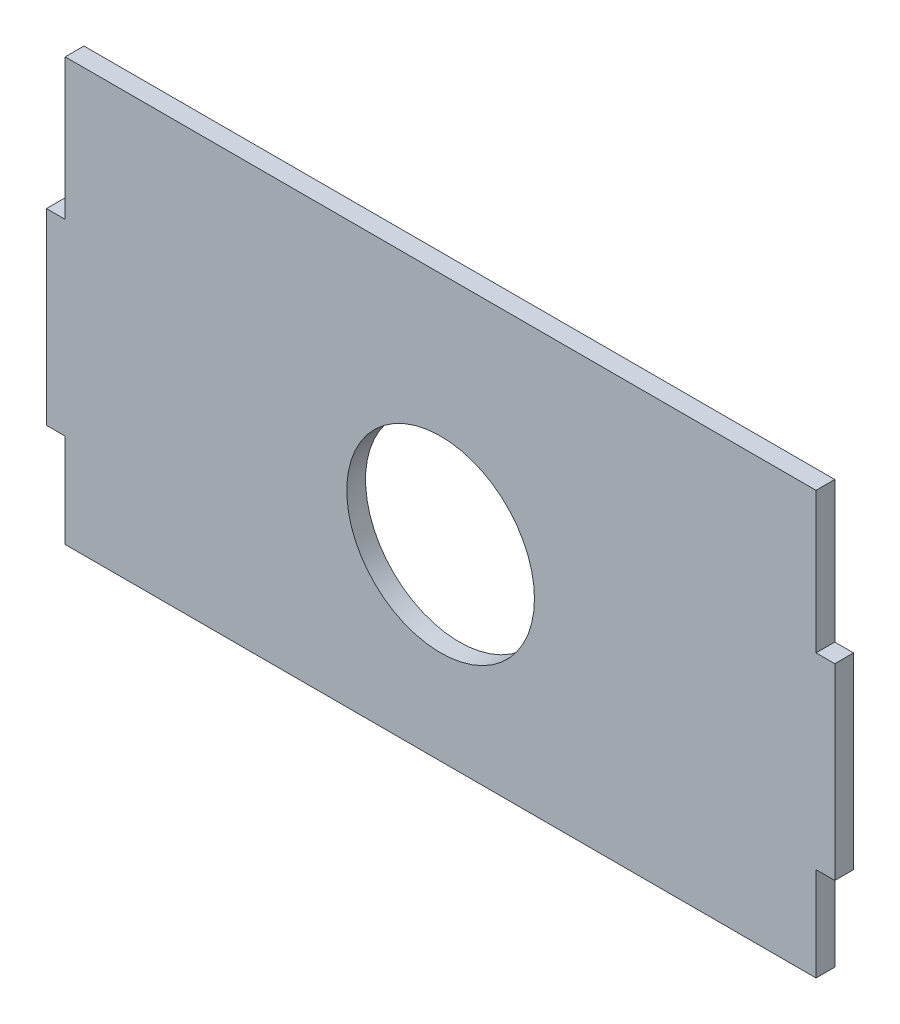
ISO-10303-21;
HEADER;
FILE_DESCRIPTION(('STEP AP214'),'2;1');
FILE_NAME('part.step','',(''),(''),'','','');
FILE_SCHEMA(('AUTOMOTIVE_DESIGN { 1 0 10303 214 1 1 1 1 }'));
ENDSEC;
DATA;
#1=APPLICATION_CONTEXT('core data for automotive mechanical design processes');
#2=APPLICATION_PROTOCOL_DEFINITION('international standard','automotive_design',2000,#1);
#3=PRODUCT_CONTEXT('',#1,'mechanical');
#4=PRODUCT('Part','Part','',(#3));
#5=PRODUCT_RELATED_PRODUCT_CATEGORY('part','',(#4));
#6=PRODUCT_DEFINITION_FORMATION('','',#4);
#7=PRODUCT_DEFINITION_CONTEXT('part definition',#1,'design');
#8=PRODUCT_DEFINITION('design','',#6,#7);
#9=PRODUCT_DEFINITION_SHAPE('','',#8);
#10=(LENGTH_UNIT() NAMED_UNIT(*) SI_UNIT(.MILLI.,.METRE.));
#11=(NAMED_UNIT(*) PLANE_ANGLE_UNIT() SI_UNIT($,.RADIAN.));
#12=(NAMED_UNIT(*) SI_UNIT($,.STERADIAN.) SOLID_ANGLE_UNIT());
#13=UNCERTAINTY_MEASURE_WITH_UNIT(LENGTH_MEASURE(1.E-05),#10,'distance_accuracy_value','');
#14=(GEOMETRIC_REPRESENTATION_CONTEXT(3) GLOBAL_UNCERTAINTY_ASSIGNED_CONTEXT((#13)) GLOBAL_UNIT_ASSIGNED_CONTEXT((#10,
#11,#12)) REPRESENTATION_CONTEXT('',''));
#15=CARTESIAN_POINT('',(0.,0.,0.));
#16=DIRECTION('',(0.,0.,1.));
#17=DIRECTION('',(1.,0.,0.));
#18=AXIS2_PLACEMENT_3D('',#15,#16,#17);
#19=CARTESIAN_POINT('',(40.,20.,2.));
#20=DIRECTION('',(0.,0.,-1.));
#21=DIRECTION('',(-1.,0.,0.));
#22=AXIS2_PLACEMENT_3D('',#19,#20,#21);
#23=CYLINDRICAL_SURFACE('',#22,10.);
#24=CARTESIAN_POINT('',(40.,20.,2.));
#25=DIRECTION('',(0.,0.,1.));
#26=DIRECTION('',(1.,0.,0.));
#27=AXIS2_PLACEMENT_3D('',#24,#25,#26);
#28=CIRCLE('',#27,10.);
#29=CARTESIAN_POINT('',(50.,20.,2.));
#30=VERTEX_POINT('',#29);
#31=EDGE_CURVE('E191',#30,#30,#28,.T.);
#32=ORIENTED_EDGE('',*,*,#31,.T.);
#33=EDGE_LOOP('',(#32));
#34=FACE_BOUND('',#33,.T.);
#35=CARTESIAN_POINT('',(40.,20.,0.));
#36=DIRECTION('',(0.,0.,1.));
#37=DIRECTION('',(1.,0.,0.));
#38=AXIS2_PLACEMENT_3D('',#35,#36,#37);
#39=CIRCLE('',#38,10.);
#40=CARTESIAN_POINT('',(50.,20.,0.));
#41=VERTEX_POINT('',#40);
#42=EDGE_CURVE('E183',#41,#41,#39,.T.);
#43=ORIENTED_EDGE('',*,*,#42,.F.);
#44=EDGE_LOOP('',(#43));
#45=FACE_BOUND('',#44,.T.);
#46=ADVANCED_FACE('F73',(#34,#45),#23,.F.);
#47=CARTESIAN_POINT('',(0.,9.99999999999996,2.));
#48=DIRECTION('',(0.,1.,0.));
#49=DIRECTION('',(0.,0.,1.));
#50=AXIS2_PLACEMENT_3D('',#47,#48,#49);
#51=PLANE('',#50);
#52=DIRECTION('',(1.,0.,0.));
#53=VECTOR('',#52,1.);
#54=CARTESIAN_POINT('',(0.,9.99999999999996,0.));
#55=LINE('',#54,#53);
#56=CARTESIAN_POINT('',(80.,9.99999999999996,0.));
#57=VERTEX_POINT('',#56);
#58=CARTESIAN_POINT('',(82.,9.99999999999996,0.));
#59=VERTEX_POINT('',#58);
#60=EDGE_CURVE('E180',#57,#59,#55,.T.);
#61=ORIENTED_EDGE('',*,*,#60,.T.);
#62=DIRECTION('',(0.,0.,-1.));
#63=VECTOR('',#62,1.);
#64=CARTESIAN_POINT('',(82.,9.99999999999996,2.));
#65=LINE('',#64,#63);
#66=CARTESIAN_POINT('',(82.,9.99999999999996,2.));
#67=VERTEX_POINT('',#66);
#68=EDGE_CURVE('E187',#67,#59,#65,.T.);
#69=ORIENTED_EDGE('',*,*,#68,.F.);
#70=DIRECTION('',(1.,0.,0.));
#71=VECTOR('',#70,1.);
#72=CARTESIAN_POINT('',(0.,9.99999999999996,2.));
#73=LINE('',#72,#71);
#74=CARTESIAN_POINT('',(80.,9.99999999999996,2.));
#75=VERTEX_POINT('',#74);
#76=EDGE_CURVE('E239',#75,#67,#73,.T.);
#77=ORIENTED_EDGE('',*,*,#76,.F.);
#78=DIRECTION('',(0.,0.,-1.));
#79=VECTOR('',#78,1.);
#80=CARTESIAN_POINT('',(80.,9.99999999999996,2.));
#81=LINE('',#80,#79);
#82=EDGE_CURVE('E190',#75,#57,#81,.T.);
#83=ORIENTED_EDGE('',*,*,#82,.T.);
#84=EDGE_LOOP('',(#61,#69,#77,#83));
#85=FACE_BOUND('',#84,.T.);
#86=ADVANCED_FACE('F236',(#85),#51,.F.);
#87=CARTESIAN_POINT('',(80.,0.,2.));
#88=DIRECTION('',(-1.,0.,0.));
#89=DIRECTION('',(0.,-1.,0.));
#90=AXIS2_PLACEMENT_3D('',#87,#88,#89);
#91=PLANE('',#90);
#92=DIRECTION('',(0.,1.,0.));
#93=VECTOR('',#92,1.);
#94=CARTESIAN_POINT('',(80.,0.,0.));
#95=LINE('',#94,#93);
#96=CARTESIAN_POINT('',(80.,0.,0.));
#97=VERTEX_POINT('',#96);
#98=EDGE_CURVE('E179',#97,#57,#95,.T.);
#99=ORIENTED_EDGE('',*,*,#98,.T.);
#100=ORIENTED_EDGE('',*,*,#82,.F.);
#101=DIRECTION('',(0.,1.,0.));
#102=VECTOR('',#101,1.);
#103=CARTESIAN_POINT('',(80.,0.,2.));
#104=LINE('',#103,#102);
#105=CARTESIAN_POINT('',(80.,0.,2.));
#106=VERTEX_POINT('',#105);
#107=EDGE_CURVE('E248',#106,#75,#104,.T.);
#108=ORIENTED_EDGE('',*,*,#107,.F.);
#109=DIRECTION('',(0.,0.,-1.));
#110=VECTOR('',#109,1.);
#111=CARTESIAN_POINT('',(80.,0.,2.));
#112=LINE('',#111,#110);
#113=EDGE_CURVE('E194',#106,#97,#112,.T.);
#114=ORIENTED_EDGE('',*,*,#113,.T.);
#115=EDGE_LOOP('',(#99,#100,#108,#114));
#116=FACE_BOUND('',#115,.T.);
#117=ADVANCED_FACE('F226',(#116),#91,.F.);
#118=CARTESIAN_POINT('',(80.,30.,0.));
#119=VERTEX_POINT('',#118);
#120=CARTESIAN_POINT('',(80.,45.,0.));
#121=VERTEX_POINT('',#120);
#122=EDGE_CURVE('E173',#119,#121,#95,.T.);
#123=ORIENTED_EDGE('',*,*,#122,.T.);
#124=DIRECTION('',(0.,0.,-1.));
#125=VECTOR('',#124,1.);
#126=CARTESIAN_POINT('',(80.,45.,2.));
#127=LINE('',#126,#125);
#128=CARTESIAN_POINT('',(80.,45.,2.));
#129=VERTEX_POINT('',#128);
#130=EDGE_CURVE('E155',#129,#121,#127,.T.);
#131=ORIENTED_EDGE('',*,*,#130,.F.);
#132=CARTESIAN_POINT('',(80.,30.,2.));
#133=VERTEX_POINT('',#132);
#134=EDGE_CURVE('E256',#133,#129,#104,.T.);
#135=ORIENTED_EDGE('',*,*,#134,.F.);
#136=DIRECTION('',(0.,0.,-1.));
#137=VECTOR('',#136,1.);
#138=CARTESIAN_POINT('',(80.,30.,2.));
#139=LINE('',#138,#137);
#140=EDGE_CURVE('E147',#133,#119,#139,.T.);
#141=ORIENTED_EDGE('',*,*,#140,.T.);
#142=EDGE_LOOP('',(#123,#131,#135,#141));
#143=FACE_BOUND('',#142,.T.);
#144=ADVANCED_FACE('F215',(#143),#91,.F.);
#145=CARTESIAN_POINT('',(0.,30.,2.));
#146=DIRECTION('',(0.,1.,0.));
#147=DIRECTION('',(0.,0.,1.));
#148=AXIS2_PLACEMENT_3D('',#145,#146,#147);
#149=PLANE('',#148);
#150=DIRECTION('',(1.,0.,0.));
#151=VECTOR('',#150,1.);
#152=CARTESIAN_POINT('',(0.,30.,0.));
#153=LINE('',#152,#151);
#154=CARTESIAN_POINT('',(82.,30.,0.));
#155=VERTEX_POINT('',#154);
#156=EDGE_CURVE('E218',#119,#155,#153,.T.);
#157=ORIENTED_EDGE('',*,*,#156,.F.);
#158=ORIENTED_EDGE('',*,*,#140,.F.);
#159=DIRECTION('',(1.,0.,0.));
#160=VECTOR('',#159,1.);
#161=CARTESIAN_POINT('',(0.,30.,2.));
#162=LINE('',#161,#160);
#163=CARTESIAN_POINT('',(82.,30.,2.));
#164=VERTEX_POINT('',#163);
#165=EDGE_CURVE('E259',#133,#164,#162,.T.);
#166=ORIENTED_EDGE('',*,*,#165,.T.);
#167=DIRECTION('',(0.,0.,-1.));
#168=VECTOR('',#167,1.);
#169=CARTESIAN_POINT('',(82.,30.,2.));
#170=LINE('',#169,#168);
#171=EDGE_CURVE('E143',#164,#155,#170,.T.);
#172=ORIENTED_EDGE('',*,*,#171,.T.);
#173=EDGE_LOOP('',(#157,#158,#166,#172));
#174=FACE_BOUND('',#173,.T.);
#175=ADVANCED_FACE('F273',(#174),#149,.T.);
#176=CARTESIAN_POINT('',(82.,0.,2.));
#177=DIRECTION('',(1.,0.,0.));
#178=DIRECTION('',(0.,0.,-1.));
#179=AXIS2_PLACEMENT_3D('',#176,#177,#178);
#180=PLANE('',#179);
#181=DIRECTION('',(0.,-1.,0.));
#182=VECTOR('',#181,1.);
#183=CARTESIAN_POINT('',(82.,0.,0.));
#184=LINE('',#183,#182);
#185=EDGE_CURVE('E219',#155,#59,#184,.T.);
#186=ORIENTED_EDGE('',*,*,#185,.F.);
#187=ORIENTED_EDGE('',*,*,#171,.F.);
#188=DIRECTION('',(0.,-1.,0.));
#189=VECTOR('',#188,1.);
#190=CARTESIAN_POINT('',(82.,0.,2.));
#191=LINE('',#190,#189);
#192=EDGE_CURVE('E186',#164,#67,#191,.T.);
#193=ORIENTED_EDGE('',*,*,#192,.T.);
#194=ORIENTED_EDGE('',*,*,#68,.T.);
#195=EDGE_LOOP('',(#186,#187,#193,#194));
#196=FACE_BOUND('',#195,.T.);
#197=ADVANCED_FACE('F264',(#196),#180,.T.);
#198=CARTESIAN_POINT('',(0.,45.,2.));
#199=DIRECTION('',(0.,1.,0.));
#200=DIRECTION('',(-1.,0.,0.));
#201=AXIS2_PLACEMENT_3D('',#198,#199,#200);
#202=PLANE('',#201);
#203=DIRECTION('',(1.,0.,0.));
#204=VECTOR('',#203,1.);
#205=CARTESIAN_POINT('',(0.,45.,0.));
#206=LINE('',#205,#204);
#207=CARTESIAN_POINT('',(0.,45.,0.));
#208=VERTEX_POINT('',#207);
#209=EDGE_CURVE('E170',#208,#121,#206,.T.);
#210=ORIENTED_EDGE('',*,*,#209,.F.);
#211=DIRECTION('',(0.,0.,-1.));
#212=VECTOR('',#211,1.);
#213=CARTESIAN_POINT('',(0.,45.,2.));
#214=LINE('',#213,#212);
#215=CARTESIAN_POINT('',(0.,45.,2.));
#216=VERTEX_POINT('',#215);
#217=EDGE_CURVE('E168',#216,#208,#214,.T.);
#218=ORIENTED_EDGE('',*,*,#217,.F.);
#219=DIRECTION('',(1.,0.,0.));
#220=VECTOR('',#219,1.);
#221=CARTESIAN_POINT('',(0.,45.,2.));
#222=LINE('',#221,#220);
#223=EDGE_CURVE('E209',#216,#129,#222,.T.);
#224=ORIENTED_EDGE('',*,*,#223,.T.);
#225=ORIENTED_EDGE('',*,*,#130,.T.);
#226=EDGE_LOOP('',(#210,#218,#224,#225));
#227=FACE_BOUND('',#226,.T.);
#228=ADVANCED_FACE('F206',(#227),#202,.T.);
#229=CARTESIAN_POINT('',(0.,0.,2.));
#230=DIRECTION('',(0.,1.,0.));
#231=DIRECTION('',(-1.,0.,0.));
#232=AXIS2_PLACEMENT_3D('',#229,#230,#231);
#233=PLANE('',#232);
#234=DIRECTION('',(1.,0.,0.));
#235=VECTOR('',#234,1.);
#236=CARTESIAN_POINT('',(0.,0.,0.));
#237=LINE('',#236,#235);
#238=CARTESIAN_POINT('',(0.,0.,0.));
#239=VERTEX_POINT('',#238);
#240=EDGE_CURVE('E172',#239,#97,#237,.T.);
#241=ORIENTED_EDGE('',*,*,#240,.T.);
#242=ORIENTED_EDGE('',*,*,#113,.F.);
#243=DIRECTION('',(1.,0.,0.));
#244=VECTOR('',#243,1.);
#245=CARTESIAN_POINT('',(0.,0.,2.));
#246=LINE('',#245,#244);
#247=CARTESIAN_POINT('',(0.,0.,2.));
#248=VERTEX_POINT('',#247);
#249=EDGE_CURVE('E249',#248,#106,#246,.T.);
#250=ORIENTED_EDGE('',*,*,#249,.F.);
#251=DIRECTION('',(0.,0.,-1.));
#252=VECTOR('',#251,1.);
#253=CARTESIAN_POINT('',(0.,0.,2.));
#254=LINE('',#253,#252);
#255=EDGE_CURVE('E197',#248,#239,#254,.T.);
#256=ORIENTED_EDGE('',*,*,#255,.T.);
#257=EDGE_LOOP('',(#241,#242,#250,#256));
#258=FACE_BOUND('',#257,.T.);
#259=ADVANCED_FACE('F293',(#258),#233,.F.);
#260=CARTESIAN_POINT('',(0.,0.,0.));
#261=DIRECTION('',(0.,0.,1.));
#262=DIRECTION('',(1.,0.,0.));
#263=AXIS2_PLACEMENT_3D('',#260,#261,#262);
#264=PLANE('',#263);
#265=ORIENTED_EDGE('',*,*,#185,.T.);
#266=ORIENTED_EDGE('',*,*,#60,.F.);
#267=ORIENTED_EDGE('',*,*,#98,.F.);
#268=ORIENTED_EDGE('',*,*,#240,.F.);
#269=DIRECTION('',(0.,1.,0.));
#270=VECTOR('',#269,1.);
#271=CARTESIAN_POINT('',(0.,0.,0.));
#272=LINE('',#271,#270);
#273=CARTESIAN_POINT('',(0.,9.99999999999996,0.));
#274=VERTEX_POINT('',#273);
#275=EDGE_CURVE('E134',#239,#274,#272,.T.);
#276=ORIENTED_EDGE('',*,*,#275,.T.);
#277=DIRECTION('',(-1.,0.,0.));
#278=VECTOR('',#277,1.);
#279=CARTESIAN_POINT('',(0.,9.99999999999996,0.));
#280=LINE('',#279,#278);
#281=CARTESIAN_POINT('',(-2.,9.99999999999996,0.));
#282=VERTEX_POINT('',#281);
#283=EDGE_CURVE('E119',#274,#282,#280,.T.);
#284=ORIENTED_EDGE('',*,*,#283,.T.);
#285=DIRECTION('',(0.,-1.,0.));
#286=VECTOR('',#285,1.);
#287=CARTESIAN_POINT('',(-2.,30.,0.));
#288=LINE('',#287,#286);
#289=CARTESIAN_POINT('',(-2.,30.,0.));
#290=VERTEX_POINT('',#289);
#291=EDGE_CURVE('E109',#290,#282,#288,.T.);
#292=ORIENTED_EDGE('',*,*,#291,.F.);
#293=DIRECTION('',(-1.,0.,0.));
#294=VECTOR('',#293,1.);
#295=CARTESIAN_POINT('',(0.,30.,0.));
#296=LINE('',#295,#294);
#297=CARTESIAN_POINT('',(0.,30.,0.));
#298=VERTEX_POINT('',#297);
#299=EDGE_CURVE('E127',#298,#290,#296,.T.);
#300=ORIENTED_EDGE('',*,*,#299,.F.);
#301=EDGE_CURVE('E164',#298,#208,#272,.T.);
#302=ORIENTED_EDGE('',*,*,#301,.T.);
#303=ORIENTED_EDGE('',*,*,#209,.T.);
#304=ORIENTED_EDGE('',*,*,#122,.F.);
#305=ORIENTED_EDGE('',*,*,#156,.T.);
#306=EDGE_LOOP('',(#265,#266,#267,#268,#276,#284,#292,#300,#302,#303,#304,#305));
#307=FACE_BOUND('',#306,.T.);
#308=ORIENTED_EDGE('',*,*,#42,.T.);
#309=EDGE_LOOP('',(#308));
#310=FACE_BOUND('',#309,.T.);
#311=ADVANCED_FACE('F130',(#307,#310),#264,.F.);
#312=CARTESIAN_POINT('',(0.,0.,2.));
#313=DIRECTION('',(0.,0.,1.));
#314=DIRECTION('',(1.,0.,0.));
#315=AXIS2_PLACEMENT_3D('',#312,#313,#314);
#316=PLANE('',#315);
#317=ORIENTED_EDGE('',*,*,#192,.F.);
#318=ORIENTED_EDGE('',*,*,#165,.F.);
#319=ORIENTED_EDGE('',*,*,#134,.T.);
#320=ORIENTED_EDGE('',*,*,#223,.F.);
#321=DIRECTION('',(0.,1.,0.));
#322=VECTOR('',#321,1.);
#323=CARTESIAN_POINT('',(0.,0.,2.));
#324=LINE('',#323,#322);
#325=CARTESIAN_POINT('',(0.,30.,2.));
#326=VERTEX_POINT('',#325);
#327=EDGE_CURVE('E254',#326,#216,#324,.T.);
#328=ORIENTED_EDGE('',*,*,#327,.F.);
#329=DIRECTION('',(-1.,0.,0.));
#330=VECTOR('',#329,1.);
#331=CARTESIAN_POINT('',(0.,30.,2.));
#332=LINE('',#331,#330);
#333=CARTESIAN_POINT('',(-2.,30.,2.));
#334=VERTEX_POINT('',#333);
#335=EDGE_CURVE('E135',#326,#334,#332,.T.);
#336=ORIENTED_EDGE('',*,*,#335,.T.);
#337=DIRECTION('',(0.,-1.,0.));
#338=VECTOR('',#337,1.);
#339=CARTESIAN_POINT('',(-2.,30.,2.));
#340=LINE('',#339,#338);
#341=CARTESIAN_POINT('',(-2.,9.99999999999996,2.));
#342=VERTEX_POINT('',#341);
#343=EDGE_CURVE('E138',#334,#342,#340,.T.);
#344=ORIENTED_EDGE('',*,*,#343,.T.);
#345=DIRECTION('',(-1.,0.,0.));
#346=VECTOR('',#345,1.);
#347=CARTESIAN_POINT('',(0.,9.99999999999996,2.));
#348=LINE('',#347,#346);
#349=CARTESIAN_POINT('',(0.,9.99999999999996,2.));
#350=VERTEX_POINT('',#349);
#351=EDGE_CURVE('E122',#350,#342,#348,.T.);
#352=ORIENTED_EDGE('',*,*,#351,.F.);
#353=EDGE_CURVE('E252',#248,#350,#324,.T.);
#354=ORIENTED_EDGE('',*,*,#353,.F.);
#355=ORIENTED_EDGE('',*,*,#249,.T.);
#356=ORIENTED_EDGE('',*,*,#107,.T.);
#357=ORIENTED_EDGE('',*,*,#76,.T.);
#358=EDGE_LOOP('',(#317,#318,#319,#320,#328,#336,#344,#352,#354,#355,#356,#357));
#359=FACE_BOUND('',#358,.T.);
#360=ORIENTED_EDGE('',*,*,#31,.F.);
#361=EDGE_LOOP('',(#360));
#362=FACE_BOUND('',#361,.T.);
#363=ADVANCED_FACE('F268',(#359,#362),#316,.T.);
#364=CARTESIAN_POINT('',(0.,0.,2.));
#365=DIRECTION('',(-1.,0.,0.));
#366=DIRECTION('',(0.,-1.,0.));
#367=AXIS2_PLACEMENT_3D('',#364,#365,#366);
#368=PLANE('',#367);
#369=ORIENTED_EDGE('',*,*,#353,.T.);
#370=DIRECTION('',(0.,0.,-1.));
#371=VECTOR('',#370,1.);
#372=CARTESIAN_POINT('',(0.,9.99999999999996,2.));
#373=LINE('',#372,#371);
#374=EDGE_CURVE('E83',#350,#274,#373,.T.);
#375=ORIENTED_EDGE('',*,*,#374,.T.);
#376=ORIENTED_EDGE('',*,*,#275,.F.);
#377=ORIENTED_EDGE('',*,*,#255,.F.);
#378=EDGE_LOOP('',(#369,#375,#376,#377));
#379=FACE_BOUND('',#378,.T.);
#380=ADVANCED_FACE('F295',(#379),#368,.T.);
#381=DIRECTION('',(0.,0.,-1.));
#382=VECTOR('',#381,1.);
#383=CARTESIAN_POINT('',(0.,30.,2.));
#384=LINE('',#383,#382);
#385=EDGE_CURVE('E12',#326,#298,#384,.T.);
#386=ORIENTED_EDGE('',*,*,#385,.F.);
#387=ORIENTED_EDGE('',*,*,#327,.T.);
#388=ORIENTED_EDGE('',*,*,#217,.T.);
#389=ORIENTED_EDGE('',*,*,#301,.F.);
#390=EDGE_LOOP('',(#386,#387,#388,#389));
#391=FACE_BOUND('',#390,.T.);
#392=ADVANCED_FACE('F166',(#391),#368,.T.);
#393=CARTESIAN_POINT('',(-2.,30.,2.));
#394=DIRECTION('',(1.,0.,0.));
#395=DIRECTION('',(0.,1.,0.));
#396=AXIS2_PLACEMENT_3D('',#393,#394,#395);
#397=PLANE('',#396);
#398=ORIENTED_EDGE('',*,*,#291,.T.);
#399=DIRECTION('',(0.,0.,-1.));
#400=VECTOR('',#399,1.);
#401=CARTESIAN_POINT('',(-2.,9.99999999999996,2.));
#402=LINE('',#401,#400);
#403=EDGE_CURVE('E116',#342,#282,#402,.T.);
#404=ORIENTED_EDGE('',*,*,#403,.F.);
#405=ORIENTED_EDGE('',*,*,#343,.F.);
#406=DIRECTION('',(0.,0.,-1.));
#407=VECTOR('',#406,1.);
#408=CARTESIAN_POINT('',(-2.,30.,2.));
#409=LINE('',#408,#407);
#410=EDGE_CURVE('E77',#334,#290,#409,.T.);
#411=ORIENTED_EDGE('',*,*,#410,.T.);
#412=EDGE_LOOP('',(#398,#404,#405,#411));
#413=FACE_BOUND('',#412,.T.);
#414=ADVANCED_FACE('F124',(#413),#397,.F.);
#415=CARTESIAN_POINT('',(0.,9.99999999999996,2.));
#416=DIRECTION('',(0.,-1.,0.));
#417=DIRECTION('',(0.,0.,-1.));
#418=AXIS2_PLACEMENT_3D('',#415,#416,#417);
#419=PLANE('',#418);
#420=ORIENTED_EDGE('',*,*,#283,.F.);
#421=ORIENTED_EDGE('',*,*,#374,.F.);
#422=ORIENTED_EDGE('',*,*,#351,.T.);
#423=ORIENTED_EDGE('',*,*,#403,.T.);
#424=EDGE_LOOP('',(#420,#421,#422,#423));
#425=FACE_BOUND('',#424,.T.);
#426=ADVANCED_FACE('F117',(#425),#419,.T.);
#427=CARTESIAN_POINT('',(0.,30.,2.));
#428=DIRECTION('',(0.,-1.,0.));
#429=DIRECTION('',(0.,0.,-1.));
#430=AXIS2_PLACEMENT_3D('',#427,#428,#429);
#431=PLANE('',#430);
#432=ORIENTED_EDGE('',*,*,#299,.T.);
#433=ORIENTED_EDGE('',*,*,#410,.F.);
#434=ORIENTED_EDGE('',*,*,#335,.F.);
#435=ORIENTED_EDGE('',*,*,#385,.T.);
#436=EDGE_LOOP('',(#432,#433,#434,#435));
#437=FACE_BOUND('',#436,.T.);
#438=ADVANCED_FACE('F75',(#437),#431,.F.);
#439=CLOSED_SHELL('',(#46,#86,#117,#144,#175,#197,#228,#259,#311,#363,#380,#392,#414,#426,#438));
#440=MANIFOLD_SOLID_BREP('B2',#439);
#441=ADVANCED_BREP_SHAPE_REPRESENTATION('',(#18,#440),#14);
#442=SHAPE_DEFINITION_REPRESENTATION(#9,#441);
ENDSEC;
END-ISO-10303-21;
